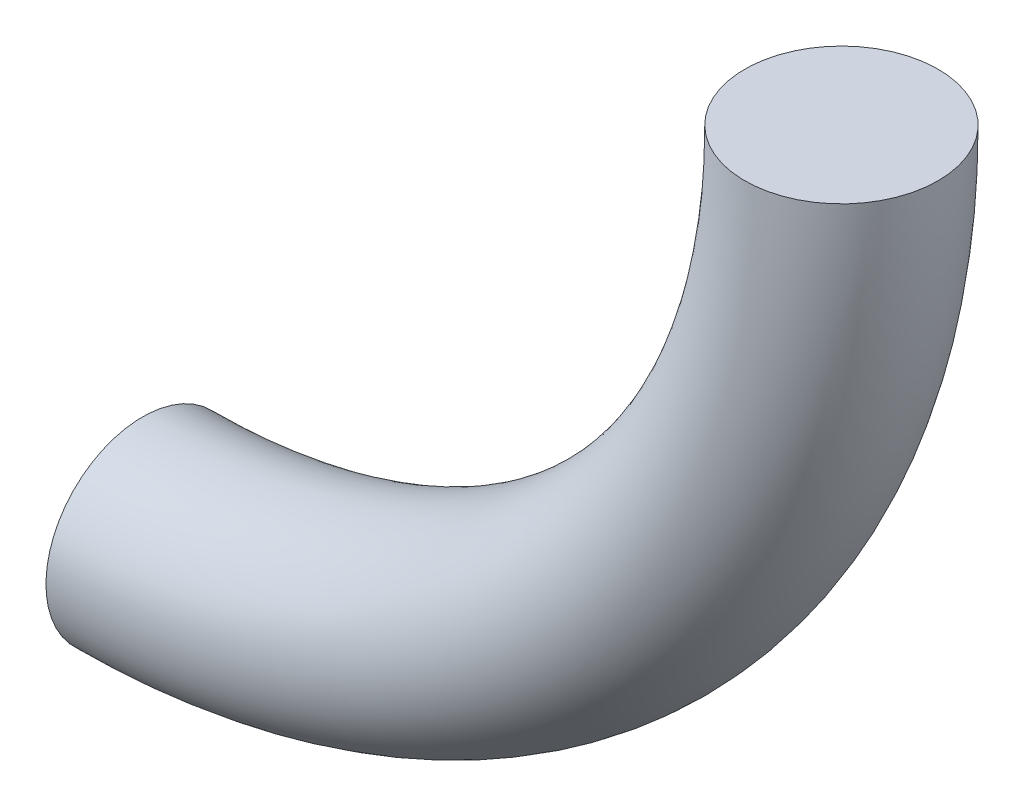
ISO-10303-21;
HEADER;
FILE_DESCRIPTION(('STEP AP214'),'2;1');
FILE_NAME('part.step','',(''),(''),'','','');
FILE_SCHEMA(('AUTOMOTIVE_DESIGN { 1 0 10303 214 1 1 1 1 }'));
ENDSEC;
DATA;
#1=APPLICATION_CONTEXT('core data for automotive mechanical design processes');
#2=APPLICATION_PROTOCOL_DEFINITION('international standard','automotive_design',2000,#1);
#3=PRODUCT_CONTEXT('',#1,'mechanical');
#4=PRODUCT('Part','Part','',(#3));
#5=PRODUCT_RELATED_PRODUCT_CATEGORY('part','',(#4));
#6=PRODUCT_DEFINITION_FORMATION('','',#4);
#7=PRODUCT_DEFINITION_CONTEXT('part definition',#1,'design');
#8=PRODUCT_DEFINITION('design','',#6,#7);
#9=PRODUCT_DEFINITION_SHAPE('','',#8);
#10=(LENGTH_UNIT() NAMED_UNIT(*) SI_UNIT(.MILLI.,.METRE.));
#11=(NAMED_UNIT(*) PLANE_ANGLE_UNIT() SI_UNIT($,.RADIAN.));
#12=(NAMED_UNIT(*) SI_UNIT($,.STERADIAN.) SOLID_ANGLE_UNIT());
#13=UNCERTAINTY_MEASURE_WITH_UNIT(LENGTH_MEASURE(1.E-05),#10,'distance_accuracy_value','');
#14=(GEOMETRIC_REPRESENTATION_CONTEXT(3) GLOBAL_UNCERTAINTY_ASSIGNED_CONTEXT((#13)) GLOBAL_UNIT_ASSIGNED_CONTEXT((#10,
#11,#12)) REPRESENTATION_CONTEXT('',''));
#15=CARTESIAN_POINT('',(0.,0.,0.));
#16=DIRECTION('',(0.,0.,1.));
#17=DIRECTION('',(1.,0.,0.));
#18=AXIS2_PLACEMENT_3D('',#15,#16,#17);
#19=CARTESIAN_POINT('',(0.,0.,0.));
#20=DIRECTION('',(1.,0.,0.));
#21=DIRECTION('',(0.,0.,-1.));
#22=AXIS2_PLACEMENT_3D('',#19,#20,#21);
#23=PLANE('',#22);
#24=CARTESIAN_POINT('',(0.,0.,0.));
#25=DIRECTION('',(1.,0.,0.));
#26=DIRECTION('',(0.,0.,-1.));
#27=AXIS2_PLACEMENT_3D('',#24,#25,#26);
#28=CIRCLE('',#27,5.713);
#29=CARTESIAN_POINT('',(0.,-5.713,0.));
#30=VERTEX_POINT('',#29);
#31=EDGE_CURVE('E44',#30,#30,#28,.T.);
#32=ORIENTED_EDGE('',*,*,#31,.F.);
#33=EDGE_LOOP('',(#32));
#34=FACE_BOUND('',#33,.T.);
#35=ADVANCED_FACE('F39',(#34),#23,.F.);
#36=CARTESIAN_POINT('',(41.297,41.297,0.));
#37=DIRECTION('',(0.,1.,0.));
#38=DIRECTION('',(0.,0.,-1.));
#39=AXIS2_PLACEMENT_3D('',#36,#37,#38);
#40=PLANE('',#39);
#41=CARTESIAN_POINT('',(41.297,41.297,0.));
#42=DIRECTION('',(0.,1.,0.));
#43=DIRECTION('',(0.,0.,-1.));
#44=AXIS2_PLACEMENT_3D('',#41,#42,#43);
#45=CIRCLE('',#44,5.713);
#46=CARTESIAN_POINT('',(47.01,41.297,0.));
#47=VERTEX_POINT('',#46);
#48=EDGE_CURVE('E10',#47,#47,#45,.T.);
#49=ORIENTED_EDGE('',*,*,#48,.T.);
#50=EDGE_LOOP('',(#49));
#51=FACE_BOUND('',#50,.T.);
#52=ADVANCED_FACE('F53',(#51),#40,.T.);
#53=CARTESIAN_POINT('',(0.,41.297,0.));
#54=DIRECTION('',(0.,0.,1.));
#55=DIRECTION('',(1.,0.,0.));
#56=AXIS2_PLACEMENT_3D('',#53,#54,#55);
#57=TOROIDAL_SURFACE('',#56,41.297,5.713);
#58=CARTESIAN_POINT('',(0.,41.297,0.));
#59=DIRECTION('',(0.,0.,1.));
#60=DIRECTION('',(1.,0.,0.));
#61=AXIS2_PLACEMENT_3D('',#58,#59,#60);
#62=CIRCLE('',#61,47.01);
#63=EDGE_CURVE('',#30,#47,#62,.T.);
#64=ORIENTED_EDGE('',*,*,#31,.T.);
#65=ORIENTED_EDGE('',*,*,#48,.F.);
#66=ORIENTED_EDGE('',*,*,#63,.T.);
#67=ORIENTED_EDGE('',*,*,#63,.F.);
#68=EDGE_LOOP('',(#64,#66,#65,#67));
#69=FACE_BOUND('',#68,.T.);
#70=ADVANCED_FACE('F51',(#69),#57,.T.);
#71=CLOSED_SHELL('',(#35,#52,#70));
#72=MANIFOLD_SOLID_BREP('B2',#71);
#73=ADVANCED_BREP_SHAPE_REPRESENTATION('',(#18,#72),#14);
#74=SHAPE_DEFINITION_REPRESENTATION(#9,#73);
ENDSEC;
END-ISO-10303-21;
